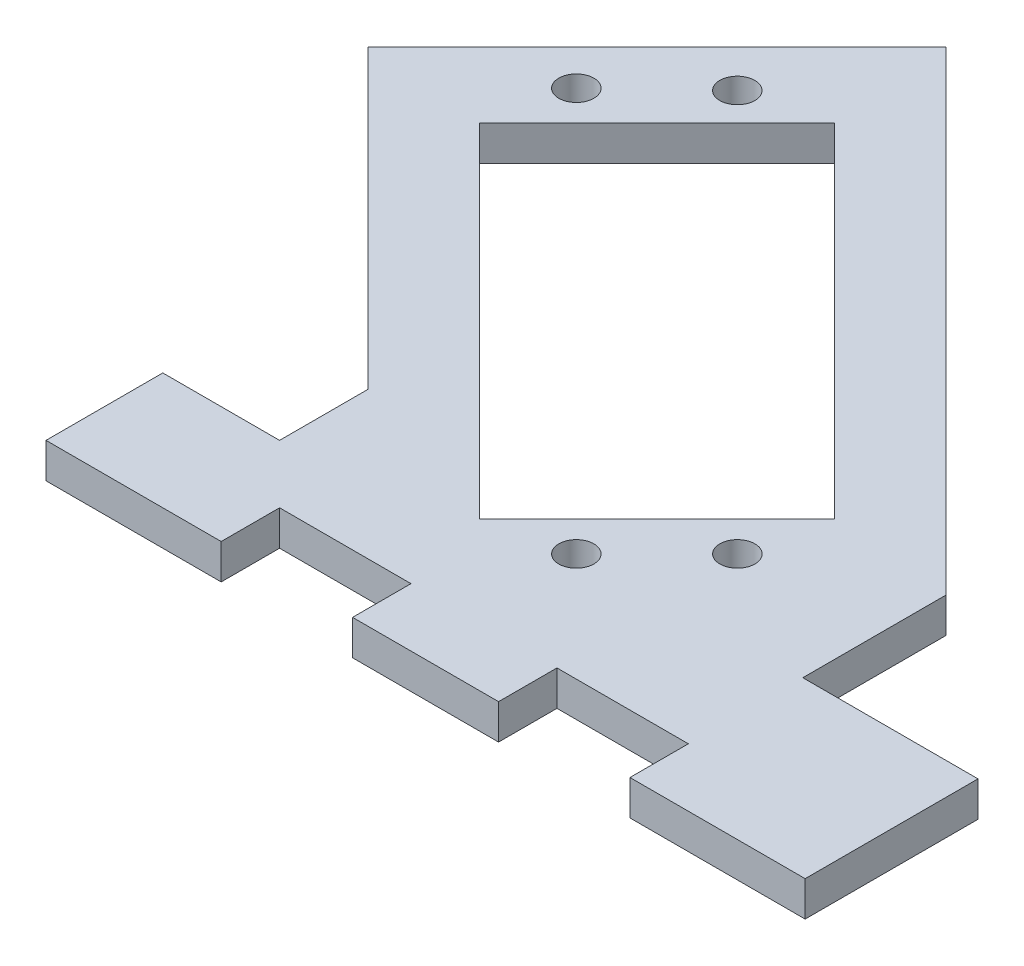
ISO-10303-21;
HEADER;
FILE_DESCRIPTION(('STEP AP214'),'2;1');
FILE_NAME('part.step','',(''),(''),'','','');
FILE_SCHEMA(('AUTOMOTIVE_DESIGN { 1 0 10303 214 1 1 1 1 }'));
ENDSEC;
DATA;
#1=APPLICATION_CONTEXT('core data for automotive mechanical design processes');
#2=APPLICATION_PROTOCOL_DEFINITION('international standard','automotive_design',2000,#1);
#3=PRODUCT_CONTEXT('',#1,'mechanical');
#4=PRODUCT('Part','Part','',(#3));
#5=PRODUCT_RELATED_PRODUCT_CATEGORY('part','',(#4));
#6=PRODUCT_DEFINITION_FORMATION('','',#4);
#7=PRODUCT_DEFINITION_CONTEXT('part definition',#1,'design');
#8=PRODUCT_DEFINITION('design','',#6,#7);
#9=PRODUCT_DEFINITION_SHAPE('','',#8);
#10=(LENGTH_UNIT() NAMED_UNIT(*) SI_UNIT(.MILLI.,.METRE.));
#11=(NAMED_UNIT(*) PLANE_ANGLE_UNIT() SI_UNIT($,.RADIAN.));
#12=(NAMED_UNIT(*) SI_UNIT($,.STERADIAN.) SOLID_ANGLE_UNIT());
#13=UNCERTAINTY_MEASURE_WITH_UNIT(LENGTH_MEASURE(1.E-05),#10,'distance_accuracy_value','');
#14=(GEOMETRIC_REPRESENTATION_CONTEXT(3) GLOBAL_UNCERTAINTY_ASSIGNED_CONTEXT((#13)) GLOBAL_UNIT_ASSIGNED_CONTEXT((#10,
#11,#12)) REPRESENTATION_CONTEXT('',''));
#15=CARTESIAN_POINT('',(0.,0.,0.));
#16=DIRECTION('',(0.,0.,1.));
#17=DIRECTION('',(1.,0.,0.));
#18=AXIS2_PLACEMENT_3D('',#15,#16,#17);
#19=CARTESIAN_POINT('',(0.,3.,0.));
#20=DIRECTION('',(0.,1.,0.));
#21=DIRECTION('',(0.,0.,1.));
#22=AXIS2_PLACEMENT_3D('',#19,#20,#21);
#23=PLANE('',#22);
#24=CARTESIAN_POINT('',(6.74820082835906,3.,-1.56030385058287));
#25=DIRECTION('',(0.,1.,0.));
#26=DIRECTION('',(0.,0.,1.));
#27=AXIS2_PLACEMENT_3D('',#24,#25,#26);
#28=CIRCLE('',#27,1.5);
#29=CARTESIAN_POINT('',(6.74820082835906,3.,-0.0603038505828715));
#30=VERTEX_POINT('',#29);
#31=EDGE_CURVE('E683',#30,#30,#28,.T.);
#32=ORIENTED_EDGE('',*,*,#31,.F.);
#33=EDGE_LOOP('',(#32));
#34=FACE_BOUND('',#33,.T.);
#35=CARTESIAN_POINT('',(-27.7846275686589,3.,-36.0931322476009));
#36=DIRECTION('',(0.,1.,0.));
#37=DIRECTION('',(0.,0.,1.));
#38=AXIS2_PLACEMENT_3D('',#35,#36,#37);
#39=CIRCLE('',#38,1.5);
#40=CARTESIAN_POINT('',(-27.7846275686589,3.,-34.5931322476009));
#41=VERTEX_POINT('',#40);
#42=EDGE_CURVE('E213',#41,#41,#39,.T.);
#43=ORIENTED_EDGE('',*,*,#42,.F.);
#44=EDGE_LOOP('',(#43));
#45=FACE_BOUND('',#44,.T.);
#46=DIRECTION('',(-0.707106781186546,0.,-0.707106781186549));
#47=VECTOR('',#46,1.);
#48=CARTESIAN_POINT('',(-15.0260191002141,3.,-54.9775522372541));
#49=LINE('',#48,#47);
#50=CARTESIAN_POINT('',(25.6239808997858,3.,-14.3275522372541));
#51=VERTEX_POINT('',#50);
#52=CARTESIAN_POINT('',(-15.0260191002141,3.,-54.9775522372541));
#53=VERTEX_POINT('',#52);
#54=EDGE_CURVE('E223',#51,#53,#49,.T.);
#55=ORIENTED_EDGE('',*,*,#54,.T.);
#56=DIRECTION('',(-0.707106781186551,0.,0.707106781186544));
#57=VECTOR('',#56,1.);
#58=CARTESIAN_POINT('',(-39.7747564417433,3.,-30.2288148957251));
#59=LINE('',#58,#57);
#60=CARTESIAN_POINT('',(-39.7747564417433,3.,-30.2288148957251));
#61=VERTEX_POINT('',#60);
#62=EDGE_CURVE('E226',#53,#61,#59,.T.);
#63=ORIENTED_EDGE('',*,*,#62,.T.);
#64=DIRECTION('',(0.707106781186546,0.,0.707106781186548));
#65=VECTOR('',#64,1.);
#66=CARTESIAN_POINT('',(-14.3760191002142,3.,-4.83007755419585));
#67=LINE('',#66,#65);
#68=CARTESIAN_POINT('',(-14.3760191002142,3.,-4.83007755419585));
#69=VERTEX_POINT('',#68);
#70=EDGE_CURVE('E229',#61,#69,#67,.T.);
#71=ORIENTED_EDGE('',*,*,#70,.T.);
#72=DIRECTION('',(0.,0.,1.));
#73=VECTOR('',#72,1.);
#74=CARTESIAN_POINT('',(-14.3760191002142,3.,-4.83007755419585));
#75=LINE('',#74,#73);
#76=CARTESIAN_POINT('',(-14.3760191002142,3.,2.7224477627459));
#77=VERTEX_POINT('',#76);
#78=EDGE_CURVE('E231',#69,#77,#75,.T.);
#79=ORIENTED_EDGE('',*,*,#78,.T.);
#80=DIRECTION('',(-1.,0.,0.));
#81=VECTOR('',#80,1.);
#82=CARTESIAN_POINT('',(-14.3760191002142,3.,2.7224477627459));
#83=LINE('',#82,#81);
#84=CARTESIAN_POINT('',(-24.3760191002142,3.,2.7224477627459));
#85=VERTEX_POINT('',#84);
#86=EDGE_CURVE('E233',#77,#85,#83,.T.);
#87=ORIENTED_EDGE('',*,*,#86,.T.);
#88=DIRECTION('',(0.,0.,1.));
#89=VECTOR('',#88,1.);
#90=CARTESIAN_POINT('',(-24.3760191002142,3.,2.7224477627459));
#91=LINE('',#90,#89);
#92=CARTESIAN_POINT('',(-24.3760191002142,3.,12.7224477627459));
#93=VERTEX_POINT('',#92);
#94=EDGE_CURVE('E235',#85,#93,#91,.T.);
#95=ORIENTED_EDGE('',*,*,#94,.T.);
#96=DIRECTION('',(1.,0.,0.));
#97=VECTOR('',#96,1.);
#98=CARTESIAN_POINT('',(-24.3760191002142,3.,12.7224477627459));
#99=LINE('',#98,#97);
#100=CARTESIAN_POINT('',(-9.3760191002142,3.,12.7224477627459));
#101=VERTEX_POINT('',#100);
#102=EDGE_CURVE('E237',#93,#101,#99,.T.);
#103=ORIENTED_EDGE('',*,*,#102,.T.);
#104=DIRECTION('',(0.,0.,-1.));
#105=VECTOR('',#104,1.);
#106=CARTESIAN_POINT('',(-9.3760191002142,3.,12.7224477627459));
#107=LINE('',#106,#105);
#108=CARTESIAN_POINT('',(-9.3760191002142,3.,7.7224477627459));
#109=VERTEX_POINT('',#108);
#110=EDGE_CURVE('E239',#101,#109,#107,.T.);
#111=ORIENTED_EDGE('',*,*,#110,.T.);
#112=DIRECTION('',(1.,0.,0.));
#113=VECTOR('',#112,1.);
#114=CARTESIAN_POINT('',(-9.3760191002142,3.,7.7224477627459));
#115=LINE('',#114,#113);
#116=CARTESIAN_POINT('',(1.87398089978579,3.,7.7224477627459));
#117=VERTEX_POINT('',#116);
#118=EDGE_CURVE('E241',#109,#117,#115,.T.);
#119=ORIENTED_EDGE('',*,*,#118,.T.);
#120=DIRECTION('',(0.,0.,1.));
#121=VECTOR('',#120,1.);
#122=CARTESIAN_POINT('',(1.87398089978579,3.,7.7224477627459));
#123=LINE('',#122,#121);
#124=CARTESIAN_POINT('',(1.87398089978579,3.,12.7224477627459));
#125=VERTEX_POINT('',#124);
#126=EDGE_CURVE('E243',#117,#125,#123,.T.);
#127=ORIENTED_EDGE('',*,*,#126,.T.);
#128=DIRECTION('',(1.,0.,0.));
#129=VECTOR('',#128,1.);
#130=CARTESIAN_POINT('',(1.87398089978579,3.,12.7224477627459));
#131=LINE('',#130,#129);
#132=CARTESIAN_POINT('',(14.3739808997858,3.,12.7224477627459));
#133=VERTEX_POINT('',#132);
#134=EDGE_CURVE('E245',#125,#133,#131,.T.);
#135=ORIENTED_EDGE('',*,*,#134,.T.);
#136=DIRECTION('',(0.,0.,-1.));
#137=VECTOR('',#136,1.);
#138=CARTESIAN_POINT('',(14.3739808997858,3.,12.7224477627459));
#139=LINE('',#138,#137);
#140=CARTESIAN_POINT('',(14.3739808997858,3.,7.7224477627459));
#141=VERTEX_POINT('',#140);
#142=EDGE_CURVE('E247',#133,#141,#139,.T.);
#143=ORIENTED_EDGE('',*,*,#142,.T.);
#144=DIRECTION('',(1.,0.,0.));
#145=VECTOR('',#144,1.);
#146=CARTESIAN_POINT('',(14.3739808997858,3.,7.7224477627459));
#147=LINE('',#146,#145);
#148=CARTESIAN_POINT('',(25.6239808997858,3.,7.7224477627459));
#149=VERTEX_POINT('',#148);
#150=EDGE_CURVE('E249',#141,#149,#147,.T.);
#151=ORIENTED_EDGE('',*,*,#150,.T.);
#152=DIRECTION('',(0.,0.,1.));
#153=VECTOR('',#152,1.);
#154=CARTESIAN_POINT('',(25.6239808997858,3.,7.7224477627459));
#155=LINE('',#154,#153);
#156=CARTESIAN_POINT('',(25.6239808997858,3.,12.7224477627459));
#157=VERTEX_POINT('',#156);
#158=EDGE_CURVE('E251',#149,#157,#155,.T.);
#159=ORIENTED_EDGE('',*,*,#158,.T.);
#160=DIRECTION('',(1.,0.,0.));
#161=VECTOR('',#160,1.);
#162=CARTESIAN_POINT('',(25.6239808997858,3.,12.7224477627459));
#163=LINE('',#162,#161);
#164=CARTESIAN_POINT('',(40.6239808997858,3.,12.7224477627459));
#165=VERTEX_POINT('',#164);
#166=EDGE_CURVE('E253',#157,#165,#163,.T.);
#167=ORIENTED_EDGE('',*,*,#166,.T.);
#168=DIRECTION('',(0.,0.,-1.));
#169=VECTOR('',#168,1.);
#170=CARTESIAN_POINT('',(40.6239808997858,3.,12.7224477627459));
#171=LINE('',#170,#169);
#172=CARTESIAN_POINT('',(40.6239808997858,3.,-2.07755223725412));
#173=VERTEX_POINT('',#172);
#174=EDGE_CURVE('E255',#165,#173,#171,.T.);
#175=ORIENTED_EDGE('',*,*,#174,.T.);
#176=DIRECTION('',(-1.,0.,0.));
#177=VECTOR('',#176,1.);
#178=CARTESIAN_POINT('',(25.6239808997858,3.,-2.07755223725411));
#179=LINE('',#178,#177);
#180=CARTESIAN_POINT('',(25.6239808997858,3.,-2.07755223725411));
#181=VERTEX_POINT('',#180);
#182=EDGE_CURVE('E257',#173,#181,#179,.T.);
#183=ORIENTED_EDGE('',*,*,#182,.T.);
#184=DIRECTION('',(0.,0.,-1.));
#185=VECTOR('',#184,1.);
#186=CARTESIAN_POINT('',(25.6239808997858,3.,-14.3275522372541));
#187=LINE('',#186,#185);
#188=EDGE_CURVE('E259',#181,#51,#187,.T.);
#189=ORIENTED_EDGE('',*,*,#188,.T.);
#190=EDGE_LOOP('',(#55,#63,#71,#79,#87,#95,#103,#111,#119,#127,#135,#143,#151,#159,#167,#175,
#183,#189));
#191=FACE_BOUND('',#190,.T.);
#192=DIRECTION('',(0.707106781186549,0.,-0.707106781186546));
#193=VECTOR('',#192,1.);
#194=CARTESIAN_POINT('',(0.,3.,0.));
#195=LINE('',#194,#193);
#196=CARTESIAN_POINT('',(0.,3.,0.));
#197=VERTEX_POINT('',#196);
#198=CARTESIAN_POINT('',(15.2027957955108,3.,-15.2027957955108));
#199=VERTEX_POINT('',#198);
#200=EDGE_CURVE('E192',#197,#199,#195,.T.);
#201=ORIENTED_EDGE('',*,*,#200,.F.);
#202=DIRECTION('',(0.707106781186546,0.,0.707106781186549));
#203=VECTOR('',#202,1.);
#204=CARTESIAN_POINT('',(-29.3449314192418,3.,-29.3449314192419));
#205=LINE('',#204,#203);
#206=CARTESIAN_POINT('',(-29.3449314192418,3.,-29.3449314192419));
#207=VERTEX_POINT('',#206);
#208=EDGE_CURVE('E184',#207,#197,#205,.T.);
#209=ORIENTED_EDGE('',*,*,#208,.F.);
#210=DIRECTION('',(-0.707106781186554,0.,0.707106781186541));
#211=VECTOR('',#210,1.);
#212=CARTESIAN_POINT('',(-14.1421356237309,3.,-44.5477272147525));
#213=LINE('',#212,#211);
#214=CARTESIAN_POINT('',(-14.1421356237309,3.,-44.5477272147525));
#215=VERTEX_POINT('',#214);
#216=EDGE_CURVE('E207',#215,#207,#213,.T.);
#217=ORIENTED_EDGE('',*,*,#216,.F.);
#218=DIRECTION('',(-0.707106781186547,0.,-0.707106781186549));
#219=VECTOR('',#218,1.);
#220=CARTESIAN_POINT('',(15.2027957955108,3.,-15.2027957955108));
#221=LINE('',#220,#219);
#222=EDGE_CURVE('E205',#199,#215,#221,.T.);
#223=ORIENTED_EDGE('',*,*,#222,.F.);
#224=EDGE_LOOP('',(#201,#209,#217,#223));
#225=FACE_BOUND('',#224,.T.);
#226=CARTESIAN_POINT('',(-20.7249311211853,3.,-42.8179509120356));
#227=DIRECTION('',(0.,1.,0.));
#228=DIRECTION('',(0.,0.,1.));
#229=AXIS2_PLACEMENT_3D('',#226,#227,#228);
#230=CIRCLE('',#229,1.5);
#231=CARTESIAN_POINT('',(-20.7249311211853,3.,-41.3179509120356));
#232=VERTEX_POINT('',#231);
#233=EDGE_CURVE('E689',#232,#232,#230,.T.);
#234=ORIENTED_EDGE('',*,*,#233,.F.);
#235=EDGE_LOOP('',(#234));
#236=FACE_BOUND('',#235,.T.);
#237=CARTESIAN_POINT('',(13.6424919449279,3.,-8.45459496715171));
#238=DIRECTION('',(0.,1.,0.));
#239=DIRECTION('',(0.,0.,1.));
#240=AXIS2_PLACEMENT_3D('',#237,#238,#239);
#241=CIRCLE('',#240,1.5);
#242=CARTESIAN_POINT('',(13.6424919449279,3.,-6.95459496715171));
#243=VERTEX_POINT('',#242);
#244=EDGE_CURVE('E674',#243,#243,#241,.T.);
#245=ORIENTED_EDGE('',*,*,#244,.F.);
#246=EDGE_LOOP('',(#245));
#247=FACE_BOUND('',#246,.T.);
#248=ADVANCED_FACE('F35',(#34,#45,#191,#225,#236,#247),#23,.T.);
#249=CARTESIAN_POINT('',(0.,0.,0.));
#250=DIRECTION('',(0.,1.,0.));
#251=DIRECTION('',(0.,0.,1.));
#252=AXIS2_PLACEMENT_3D('',#249,#250,#251);
#253=PLANE('',#252);
#254=DIRECTION('',(-0.707106781186546,0.,-0.707106781186549));
#255=VECTOR('',#254,1.);
#256=CARTESIAN_POINT('',(-15.0260191002141,0.,-54.9775522372541));
#257=LINE('',#256,#255);
#258=CARTESIAN_POINT('',(25.6239808997858,0.,-14.3275522372541));
#259=VERTEX_POINT('',#258);
#260=CARTESIAN_POINT('',(-15.0260191002141,0.,-54.9775522372541));
#261=VERTEX_POINT('',#260);
#262=EDGE_CURVE('E200',#259,#261,#257,.T.);
#263=ORIENTED_EDGE('',*,*,#262,.F.);
#264=DIRECTION('',(0.,0.,-1.));
#265=VECTOR('',#264,1.);
#266=CARTESIAN_POINT('',(25.6239808997858,0.,-14.3275522372541));
#267=LINE('',#266,#265);
#268=CARTESIAN_POINT('',(25.6239808997858,0.,-2.07755223725411));
#269=VERTEX_POINT('',#268);
#270=EDGE_CURVE('E227',#269,#259,#267,.T.);
#271=ORIENTED_EDGE('',*,*,#270,.F.);
#272=DIRECTION('',(-1.,0.,0.));
#273=VECTOR('',#272,1.);
#274=CARTESIAN_POINT('',(25.6239808997858,0.,-2.07755223725411));
#275=LINE('',#274,#273);
#276=CARTESIAN_POINT('',(40.6239808997858,0.,-2.07755223725412));
#277=VERTEX_POINT('',#276);
#278=EDGE_CURVE('E294',#277,#269,#275,.T.);
#279=ORIENTED_EDGE('',*,*,#278,.F.);
#280=DIRECTION('',(0.,0.,-1.));
#281=VECTOR('',#280,1.);
#282=CARTESIAN_POINT('',(40.6239808997858,0.,12.7224477627459));
#283=LINE('',#282,#281);
#284=CARTESIAN_POINT('',(40.6239808997858,0.,12.7224477627459));
#285=VERTEX_POINT('',#284);
#286=EDGE_CURVE('E292',#285,#277,#283,.T.);
#287=ORIENTED_EDGE('',*,*,#286,.F.);
#288=DIRECTION('',(1.,0.,0.));
#289=VECTOR('',#288,1.);
#290=CARTESIAN_POINT('',(25.6239808997858,0.,12.7224477627459));
#291=LINE('',#290,#289);
#292=CARTESIAN_POINT('',(25.6239808997858,0.,12.7224477627459));
#293=VERTEX_POINT('',#292);
#294=EDGE_CURVE('E290',#293,#285,#291,.T.);
#295=ORIENTED_EDGE('',*,*,#294,.F.);
#296=DIRECTION('',(0.,0.,1.));
#297=VECTOR('',#296,1.);
#298=CARTESIAN_POINT('',(25.6239808997858,0.,7.7224477627459));
#299=LINE('',#298,#297);
#300=CARTESIAN_POINT('',(25.6239808997858,0.,7.7224477627459));
#301=VERTEX_POINT('',#300);
#302=EDGE_CURVE('E288',#301,#293,#299,.T.);
#303=ORIENTED_EDGE('',*,*,#302,.F.);
#304=DIRECTION('',(1.,0.,0.));
#305=VECTOR('',#304,1.);
#306=CARTESIAN_POINT('',(14.3739808997858,0.,7.7224477627459));
#307=LINE('',#306,#305);
#308=CARTESIAN_POINT('',(14.3739808997858,0.,7.7224477627459));
#309=VERTEX_POINT('',#308);
#310=EDGE_CURVE('E286',#309,#301,#307,.T.);
#311=ORIENTED_EDGE('',*,*,#310,.F.);
#312=DIRECTION('',(0.,0.,-1.));
#313=VECTOR('',#312,1.);
#314=CARTESIAN_POINT('',(14.3739808997858,0.,12.7224477627459));
#315=LINE('',#314,#313);
#316=CARTESIAN_POINT('',(14.3739808997858,0.,12.7224477627459));
#317=VERTEX_POINT('',#316);
#318=EDGE_CURVE('E284',#317,#309,#315,.T.);
#319=ORIENTED_EDGE('',*,*,#318,.F.);
#320=DIRECTION('',(1.,0.,0.));
#321=VECTOR('',#320,1.);
#322=CARTESIAN_POINT('',(1.87398089978579,0.,12.7224477627459));
#323=LINE('',#322,#321);
#324=CARTESIAN_POINT('',(1.87398089978579,0.,12.7224477627459));
#325=VERTEX_POINT('',#324);
#326=EDGE_CURVE('E282',#325,#317,#323,.T.);
#327=ORIENTED_EDGE('',*,*,#326,.F.);
#328=DIRECTION('',(0.,0.,1.));
#329=VECTOR('',#328,1.);
#330=CARTESIAN_POINT('',(1.87398089978579,0.,7.7224477627459));
#331=LINE('',#330,#329);
#332=CARTESIAN_POINT('',(1.87398089978579,0.,7.7224477627459));
#333=VERTEX_POINT('',#332);
#334=EDGE_CURVE('E280',#333,#325,#331,.T.);
#335=ORIENTED_EDGE('',*,*,#334,.F.);
#336=DIRECTION('',(1.,0.,0.));
#337=VECTOR('',#336,1.);
#338=CARTESIAN_POINT('',(-9.3760191002142,0.,7.7224477627459));
#339=LINE('',#338,#337);
#340=CARTESIAN_POINT('',(-9.3760191002142,0.,7.7224477627459));
#341=VERTEX_POINT('',#340);
#342=EDGE_CURVE('E278',#341,#333,#339,.T.);
#343=ORIENTED_EDGE('',*,*,#342,.F.);
#344=DIRECTION('',(0.,0.,-1.));
#345=VECTOR('',#344,1.);
#346=CARTESIAN_POINT('',(-9.3760191002142,0.,12.7224477627459));
#347=LINE('',#346,#345);
#348=CARTESIAN_POINT('',(-9.3760191002142,0.,12.7224477627459));
#349=VERTEX_POINT('',#348);
#350=EDGE_CURVE('E276',#349,#341,#347,.T.);
#351=ORIENTED_EDGE('',*,*,#350,.F.);
#352=DIRECTION('',(1.,0.,0.));
#353=VECTOR('',#352,1.);
#354=CARTESIAN_POINT('',(-24.3760191002142,0.,12.7224477627459));
#355=LINE('',#354,#353);
#356=CARTESIAN_POINT('',(-24.3760191002142,0.,12.7224477627459));
#357=VERTEX_POINT('',#356);
#358=EDGE_CURVE('E274',#357,#349,#355,.T.);
#359=ORIENTED_EDGE('',*,*,#358,.F.);
#360=DIRECTION('',(0.,0.,1.));
#361=VECTOR('',#360,1.);
#362=CARTESIAN_POINT('',(-24.3760191002142,0.,2.7224477627459));
#363=LINE('',#362,#361);
#364=CARTESIAN_POINT('',(-24.3760191002142,0.,2.7224477627459));
#365=VERTEX_POINT('',#364);
#366=EDGE_CURVE('E272',#365,#357,#363,.T.);
#367=ORIENTED_EDGE('',*,*,#366,.F.);
#368=DIRECTION('',(-1.,0.,0.));
#369=VECTOR('',#368,1.);
#370=CARTESIAN_POINT('',(-14.3760191002142,0.,2.7224477627459));
#371=LINE('',#370,#369);
#372=CARTESIAN_POINT('',(-14.3760191002142,0.,2.7224477627459));
#373=VERTEX_POINT('',#372);
#374=EDGE_CURVE('E270',#373,#365,#371,.T.);
#375=ORIENTED_EDGE('',*,*,#374,.F.);
#376=DIRECTION('',(0.,0.,1.));
#377=VECTOR('',#376,1.);
#378=CARTESIAN_POINT('',(-14.3760191002142,0.,-4.83007755419585));
#379=LINE('',#378,#377);
#380=CARTESIAN_POINT('',(-14.3760191002142,0.,-4.83007755419585));
#381=VERTEX_POINT('',#380);
#382=EDGE_CURVE('E268',#381,#373,#379,.T.);
#383=ORIENTED_EDGE('',*,*,#382,.F.);
#384=DIRECTION('',(0.707106781186546,0.,0.707106781186548));
#385=VECTOR('',#384,1.);
#386=CARTESIAN_POINT('',(-14.3760191002142,0.,-4.83007755419585));
#387=LINE('',#386,#385);
#388=CARTESIAN_POINT('',(-39.7747564417433,0.,-30.2288148957251));
#389=VERTEX_POINT('',#388);
#390=EDGE_CURVE('E266',#389,#381,#387,.T.);
#391=ORIENTED_EDGE('',*,*,#390,.F.);
#392=DIRECTION('',(-0.707106781186551,0.,0.707106781186544));
#393=VECTOR('',#392,1.);
#394=CARTESIAN_POINT('',(-39.7747564417433,0.,-30.2288148957251));
#395=LINE('',#394,#393);
#396=EDGE_CURVE('E264',#261,#389,#395,.T.);
#397=ORIENTED_EDGE('',*,*,#396,.F.);
#398=EDGE_LOOP('',(#263,#271,#279,#287,#295,#303,#311,#319,#327,#335,#343,#351,#359,#367,#375,
#383,#391,#397));
#399=FACE_BOUND('',#398,.T.);
#400=DIRECTION('',(0.707106781186546,0.,0.707106781186549));
#401=VECTOR('',#400,1.);
#402=CARTESIAN_POINT('',(-29.3449314192418,0.,-29.3449314192419));
#403=LINE('',#402,#401);
#404=CARTESIAN_POINT('',(-29.3449314192418,0.,-29.3449314192419));
#405=VERTEX_POINT('',#404);
#406=CARTESIAN_POINT('',(0.,0.,0.));
#407=VERTEX_POINT('',#406);
#408=EDGE_CURVE('E58',#405,#407,#403,.T.);
#409=ORIENTED_EDGE('',*,*,#408,.T.);
#410=DIRECTION('',(0.707106781186549,0.,-0.707106781186546));
#411=VECTOR('',#410,1.);
#412=CARTESIAN_POINT('',(0.,0.,0.));
#413=LINE('',#412,#411);
#414=CARTESIAN_POINT('',(15.2027957955108,0.,-15.2027957955108));
#415=VERTEX_POINT('',#414);
#416=EDGE_CURVE('E199',#407,#415,#413,.T.);
#417=ORIENTED_EDGE('',*,*,#416,.T.);
#418=DIRECTION('',(-0.707106781186547,0.,-0.707106781186549));
#419=VECTOR('',#418,1.);
#420=CARTESIAN_POINT('',(15.2027957955108,0.,-15.2027957955108));
#421=LINE('',#420,#419);
#422=CARTESIAN_POINT('',(-14.1421356237309,0.,-44.5477272147525));
#423=VERTEX_POINT('',#422);
#424=EDGE_CURVE('E215',#415,#423,#421,.T.);
#425=ORIENTED_EDGE('',*,*,#424,.T.);
#426=DIRECTION('',(-0.707106781186554,0.,0.707106781186541));
#427=VECTOR('',#426,1.);
#428=CARTESIAN_POINT('',(-14.1421356237309,0.,-44.5477272147525));
#429=LINE('',#428,#427);
#430=EDGE_CURVE('E193',#423,#405,#429,.T.);
#431=ORIENTED_EDGE('',*,*,#430,.T.);
#432=EDGE_LOOP('',(#409,#417,#425,#431));
#433=FACE_BOUND('',#432,.T.);
#434=CARTESIAN_POINT('',(-27.7846275686589,0.,-36.0931322476009));
#435=DIRECTION('',(0.,1.,0.));
#436=DIRECTION('',(0.,0.,1.));
#437=AXIS2_PLACEMENT_3D('',#434,#435,#436);
#438=CIRCLE('',#437,1.5);
#439=CARTESIAN_POINT('',(-27.7846275686589,0.,-34.5931322476009));
#440=VERTEX_POINT('',#439);
#441=EDGE_CURVE('E692',#440,#440,#438,.T.);
#442=ORIENTED_EDGE('',*,*,#441,.T.);
#443=EDGE_LOOP('',(#442));
#444=FACE_BOUND('',#443,.T.);
#445=CARTESIAN_POINT('',(-20.7249311211853,0.,-42.8179509120356));
#446=DIRECTION('',(0.,1.,0.));
#447=DIRECTION('',(0.,0.,1.));
#448=AXIS2_PLACEMENT_3D('',#445,#446,#447);
#449=CIRCLE('',#448,1.5);
#450=CARTESIAN_POINT('',(-20.7249311211853,0.,-41.3179509120356));
#451=VERTEX_POINT('',#450);
#452=EDGE_CURVE('E686',#451,#451,#449,.T.);
#453=ORIENTED_EDGE('',*,*,#452,.T.);
#454=EDGE_LOOP('',(#453));
#455=FACE_BOUND('',#454,.T.);
#456=CARTESIAN_POINT('',(6.74820082835906,0.,-1.56030385058287));
#457=DIRECTION('',(0.,1.,0.));
#458=DIRECTION('',(0.,0.,1.));
#459=AXIS2_PLACEMENT_3D('',#456,#457,#458);
#460=CIRCLE('',#459,1.5);
#461=CARTESIAN_POINT('',(6.74820082835906,0.,-0.0603038505828715));
#462=VERTEX_POINT('',#461);
#463=EDGE_CURVE('E680',#462,#462,#460,.T.);
#464=ORIENTED_EDGE('',*,*,#463,.T.);
#465=EDGE_LOOP('',(#464));
#466=FACE_BOUND('',#465,.T.);
#467=CARTESIAN_POINT('',(13.6424919449279,0.,-8.45459496715171));
#468=DIRECTION('',(0.,1.,0.));
#469=DIRECTION('',(0.,0.,1.));
#470=AXIS2_PLACEMENT_3D('',#467,#468,#469);
#471=CIRCLE('',#470,1.5);
#472=CARTESIAN_POINT('',(13.6424919449279,0.,-6.95459496715171));
#473=VERTEX_POINT('',#472);
#474=EDGE_CURVE('E677',#473,#473,#471,.T.);
#475=ORIENTED_EDGE('',*,*,#474,.T.);
#476=EDGE_LOOP('',(#475));
#477=FACE_BOUND('',#476,.T.);
#478=ADVANCED_FACE('F354',(#399,#433,#444,#455,#466,#477),#253,.F.);
#479=CARTESIAN_POINT('',(-15.0260191002141,3.,-54.9775522372541));
#480=DIRECTION('',(-0.707106781186548,0.,0.707106781186546));
#481=DIRECTION('',(0.707106781186546,0.,0.707106781186549));
#482=AXIS2_PLACEMENT_3D('',#479,#480,#481);
#483=PLANE('',#482);
#484=ORIENTED_EDGE('',*,*,#262,.T.);
#485=DIRECTION('',(0.,-1.,0.));
#486=VECTOR('',#485,1.);
#487=CARTESIAN_POINT('',(-15.0260191002141,3.,-54.9775522372541));
#488=LINE('',#487,#486);
#489=EDGE_CURVE('E11',#53,#261,#488,.T.);
#490=ORIENTED_EDGE('',*,*,#489,.F.);
#491=ORIENTED_EDGE('',*,*,#54,.F.);
#492=DIRECTION('',(0.,-1.,0.));
#493=VECTOR('',#492,1.);
#494=CARTESIAN_POINT('',(25.6239808997858,3.,-14.3275522372541));
#495=LINE('',#494,#493);
#496=EDGE_CURVE('E261',#51,#259,#495,.T.);
#497=ORIENTED_EDGE('',*,*,#496,.T.);
#498=EDGE_LOOP('',(#484,#490,#491,#497));
#499=FACE_BOUND('',#498,.T.);
#500=ADVANCED_FACE('F37',(#499),#483,.F.);
#501=CARTESIAN_POINT('',(-39.7747564417433,3.,-30.2288148957251));
#502=DIRECTION('',(0.707106781186544,0.,0.707106781186551));
#503=DIRECTION('',(0.707106781186551,0.,-0.707106781186544));
#504=AXIS2_PLACEMENT_3D('',#501,#502,#503);
#505=PLANE('',#504);
#506=ORIENTED_EDGE('',*,*,#396,.T.);
#507=DIRECTION('',(0.,-1.,0.));
#508=VECTOR('',#507,1.);
#509=CARTESIAN_POINT('',(-39.7747564417433,3.,-30.2288148957251));
#510=LINE('',#509,#508);
#511=EDGE_CURVE('E43',#61,#389,#510,.T.);
#512=ORIENTED_EDGE('',*,*,#511,.F.);
#513=ORIENTED_EDGE('',*,*,#62,.F.);
#514=ORIENTED_EDGE('',*,*,#489,.T.);
#515=EDGE_LOOP('',(#506,#512,#513,#514));
#516=FACE_BOUND('',#515,.T.);
#517=ADVANCED_FACE('F371',(#516),#505,.F.);
#518=CARTESIAN_POINT('',(-14.3760191002142,3.,-4.83007755419585));
#519=DIRECTION('',(0.707106781186548,0.,-0.707106781186547));
#520=DIRECTION('',(-0.707106781186547,0.,-0.707106781186548));
#521=AXIS2_PLACEMENT_3D('',#518,#519,#520);
#522=PLANE('',#521);
#523=ORIENTED_EDGE('',*,*,#390,.T.);
#524=DIRECTION('',(0.,-1.,0.));
#525=VECTOR('',#524,1.);
#526=CARTESIAN_POINT('',(-14.3760191002142,3.,-4.83007755419585));
#527=LINE('',#526,#525);
#528=EDGE_CURVE('E341',#69,#381,#527,.T.);
#529=ORIENTED_EDGE('',*,*,#528,.F.);
#530=ORIENTED_EDGE('',*,*,#70,.F.);
#531=ORIENTED_EDGE('',*,*,#511,.T.);
#532=EDGE_LOOP('',(#523,#529,#530,#531));
#533=FACE_BOUND('',#532,.T.);
#534=ADVANCED_FACE('F348',(#533),#522,.F.);
#535=CARTESIAN_POINT('',(-14.3760191002142,3.,-4.83007755419585));
#536=DIRECTION('',(1.,0.,0.));
#537=DIRECTION('',(0.,0.,-1.));
#538=AXIS2_PLACEMENT_3D('',#535,#536,#537);
#539=PLANE('',#538);
#540=ORIENTED_EDGE('',*,*,#382,.T.);
#541=DIRECTION('',(0.,-1.,0.));
#542=VECTOR('',#541,1.);
#543=CARTESIAN_POINT('',(-14.3760191002142,3.,2.7224477627459));
#544=LINE('',#543,#542);
#545=EDGE_CURVE('E338',#77,#373,#544,.T.);
#546=ORIENTED_EDGE('',*,*,#545,.F.);
#547=ORIENTED_EDGE('',*,*,#78,.F.);
#548=ORIENTED_EDGE('',*,*,#528,.T.);
#549=EDGE_LOOP('',(#540,#546,#547,#548));
#550=FACE_BOUND('',#549,.T.);
#551=ADVANCED_FACE('F360',(#550),#539,.F.);
#552=CARTESIAN_POINT('',(-14.3760191002142,3.,2.7224477627459));
#553=DIRECTION('',(0.,0.,1.));
#554=DIRECTION('',(1.,0.,0.));
#555=AXIS2_PLACEMENT_3D('',#552,#553,#554);
#556=PLANE('',#555);
#557=ORIENTED_EDGE('',*,*,#374,.T.);
#558=DIRECTION('',(0.,-1.,0.));
#559=VECTOR('',#558,1.);
#560=CARTESIAN_POINT('',(-24.3760191002142,3.,2.7224477627459));
#561=LINE('',#560,#559);
#562=EDGE_CURVE('E335',#85,#365,#561,.T.);
#563=ORIENTED_EDGE('',*,*,#562,.F.);
#564=ORIENTED_EDGE('',*,*,#86,.F.);
#565=ORIENTED_EDGE('',*,*,#545,.T.);
#566=EDGE_LOOP('',(#557,#563,#564,#565));
#567=FACE_BOUND('',#566,.T.);
#568=ADVANCED_FACE('F364',(#567),#556,.F.);
#569=CARTESIAN_POINT('',(-24.3760191002142,3.,2.7224477627459));
#570=DIRECTION('',(1.,0.,0.));
#571=DIRECTION('',(0.,0.,-1.));
#572=AXIS2_PLACEMENT_3D('',#569,#570,#571);
#573=PLANE('',#572);
#574=ORIENTED_EDGE('',*,*,#366,.T.);
#575=DIRECTION('',(0.,-1.,0.));
#576=VECTOR('',#575,1.);
#577=CARTESIAN_POINT('',(-24.3760191002142,3.,12.7224477627459));
#578=LINE('',#577,#576);
#579=EDGE_CURVE('E332',#93,#357,#578,.T.);
#580=ORIENTED_EDGE('',*,*,#579,.F.);
#581=ORIENTED_EDGE('',*,*,#94,.F.);
#582=ORIENTED_EDGE('',*,*,#562,.T.);
#583=EDGE_LOOP('',(#574,#580,#581,#582));
#584=FACE_BOUND('',#583,.T.);
#585=ADVANCED_FACE('F434',(#584),#573,.F.);
#586=CARTESIAN_POINT('',(-24.3760191002142,3.,12.7224477627459));
#587=DIRECTION('',(0.,0.,-1.));
#588=DIRECTION('',(-1.,0.,0.));
#589=AXIS2_PLACEMENT_3D('',#586,#587,#588);
#590=PLANE('',#589);
#591=ORIENTED_EDGE('',*,*,#358,.T.);
#592=DIRECTION('',(0.,-1.,0.));
#593=VECTOR('',#592,1.);
#594=CARTESIAN_POINT('',(-9.3760191002142,3.,12.7224477627459));
#595=LINE('',#594,#593);
#596=EDGE_CURVE('E329',#101,#349,#595,.T.);
#597=ORIENTED_EDGE('',*,*,#596,.F.);
#598=ORIENTED_EDGE('',*,*,#102,.F.);
#599=ORIENTED_EDGE('',*,*,#579,.T.);
#600=EDGE_LOOP('',(#591,#597,#598,#599));
#601=FACE_BOUND('',#600,.T.);
#602=ADVANCED_FACE('F432',(#601),#590,.F.);
#603=CARTESIAN_POINT('',(-9.3760191002142,3.,12.7224477627459));
#604=DIRECTION('',(-1.,0.,0.));
#605=DIRECTION('',(0.,0.,1.));
#606=AXIS2_PLACEMENT_3D('',#603,#604,#605);
#607=PLANE('',#606);
#608=ORIENTED_EDGE('',*,*,#350,.T.);
#609=DIRECTION('',(0.,-1.,0.));
#610=VECTOR('',#609,1.);
#611=CARTESIAN_POINT('',(-9.3760191002142,3.,7.7224477627459));
#612=LINE('',#611,#610);
#613=EDGE_CURVE('E326',#109,#341,#612,.T.);
#614=ORIENTED_EDGE('',*,*,#613,.F.);
#615=ORIENTED_EDGE('',*,*,#110,.F.);
#616=ORIENTED_EDGE('',*,*,#596,.T.);
#617=EDGE_LOOP('',(#608,#614,#615,#616));
#618=FACE_BOUND('',#617,.T.);
#619=ADVANCED_FACE('F428',(#618),#607,.F.);
#620=CARTESIAN_POINT('',(-9.3760191002142,3.,7.7224477627459));
#621=DIRECTION('',(0.,0.,-1.));
#622=DIRECTION('',(-1.,0.,0.));
#623=AXIS2_PLACEMENT_3D('',#620,#621,#622);
#624=PLANE('',#623);
#625=ORIENTED_EDGE('',*,*,#342,.T.);
#626=DIRECTION('',(0.,-1.,0.));
#627=VECTOR('',#626,1.);
#628=CARTESIAN_POINT('',(1.87398089978579,3.,7.7224477627459));
#629=LINE('',#628,#627);
#630=EDGE_CURVE('E323',#117,#333,#629,.T.);
#631=ORIENTED_EDGE('',*,*,#630,.F.);
#632=ORIENTED_EDGE('',*,*,#118,.F.);
#633=ORIENTED_EDGE('',*,*,#613,.T.);
#634=EDGE_LOOP('',(#625,#631,#632,#633));
#635=FACE_BOUND('',#634,.T.);
#636=ADVANCED_FACE('F423',(#635),#624,.F.);
#637=CARTESIAN_POINT('',(1.87398089978579,3.,7.7224477627459));
#638=DIRECTION('',(1.,0.,0.));
#639=DIRECTION('',(0.,0.,-1.));
#640=AXIS2_PLACEMENT_3D('',#637,#638,#639);
#641=PLANE('',#640);
#642=ORIENTED_EDGE('',*,*,#334,.T.);
#643=DIRECTION('',(0.,-1.,0.));
#644=VECTOR('',#643,1.);
#645=CARTESIAN_POINT('',(1.87398089978579,3.,12.7224477627459));
#646=LINE('',#645,#644);
#647=EDGE_CURVE('E320',#125,#325,#646,.T.);
#648=ORIENTED_EDGE('',*,*,#647,.F.);
#649=ORIENTED_EDGE('',*,*,#126,.F.);
#650=ORIENTED_EDGE('',*,*,#630,.T.);
#651=EDGE_LOOP('',(#642,#648,#649,#650));
#652=FACE_BOUND('',#651,.T.);
#653=ADVANCED_FACE('F417',(#652),#641,.F.);
#654=CARTESIAN_POINT('',(1.87398089978579,3.,12.7224477627459));
#655=DIRECTION('',(0.,0.,-1.));
#656=DIRECTION('',(-1.,0.,0.));
#657=AXIS2_PLACEMENT_3D('',#654,#655,#656);
#658=PLANE('',#657);
#659=ORIENTED_EDGE('',*,*,#326,.T.);
#660=DIRECTION('',(0.,-1.,0.));
#661=VECTOR('',#660,1.);
#662=CARTESIAN_POINT('',(14.3739808997858,3.,12.7224477627459));
#663=LINE('',#662,#661);
#664=EDGE_CURVE('E317',#133,#317,#663,.T.);
#665=ORIENTED_EDGE('',*,*,#664,.F.);
#666=ORIENTED_EDGE('',*,*,#134,.F.);
#667=ORIENTED_EDGE('',*,*,#647,.T.);
#668=EDGE_LOOP('',(#659,#665,#666,#667));
#669=FACE_BOUND('',#668,.T.);
#670=ADVANCED_FACE('F413',(#669),#658,.F.);
#671=CARTESIAN_POINT('',(14.3739808997858,3.,12.7224477627459));
#672=DIRECTION('',(-1.,0.,0.));
#673=DIRECTION('',(0.,0.,1.));
#674=AXIS2_PLACEMENT_3D('',#671,#672,#673);
#675=PLANE('',#674);
#676=ORIENTED_EDGE('',*,*,#318,.T.);
#677=DIRECTION('',(0.,-1.,0.));
#678=VECTOR('',#677,1.);
#679=CARTESIAN_POINT('',(14.3739808997858,3.,7.7224477627459));
#680=LINE('',#679,#678);
#681=EDGE_CURVE('E314',#141,#309,#680,.T.);
#682=ORIENTED_EDGE('',*,*,#681,.F.);
#683=ORIENTED_EDGE('',*,*,#142,.F.);
#684=ORIENTED_EDGE('',*,*,#664,.T.);
#685=EDGE_LOOP('',(#676,#682,#683,#684));
#686=FACE_BOUND('',#685,.T.);
#687=ADVANCED_FACE('F408',(#686),#675,.F.);
#688=CARTESIAN_POINT('',(14.3739808997858,3.,7.7224477627459));
#689=DIRECTION('',(0.,0.,-1.));
#690=DIRECTION('',(-1.,0.,0.));
#691=AXIS2_PLACEMENT_3D('',#688,#689,#690);
#692=PLANE('',#691);
#693=ORIENTED_EDGE('',*,*,#310,.T.);
#694=DIRECTION('',(0.,-1.,0.));
#695=VECTOR('',#694,1.);
#696=CARTESIAN_POINT('',(25.6239808997858,3.,7.7224477627459));
#697=LINE('',#696,#695);
#698=EDGE_CURVE('E311',#149,#301,#697,.T.);
#699=ORIENTED_EDGE('',*,*,#698,.F.);
#700=ORIENTED_EDGE('',*,*,#150,.F.);
#701=ORIENTED_EDGE('',*,*,#681,.T.);
#702=EDGE_LOOP('',(#693,#699,#700,#701));
#703=FACE_BOUND('',#702,.T.);
#704=ADVANCED_FACE('F402',(#703),#692,.F.);
#705=CARTESIAN_POINT('',(25.6239808997858,3.,7.7224477627459));
#706=DIRECTION('',(1.,0.,0.));
#707=DIRECTION('',(0.,0.,-1.));
#708=AXIS2_PLACEMENT_3D('',#705,#706,#707);
#709=PLANE('',#708);
#710=ORIENTED_EDGE('',*,*,#302,.T.);
#711=DIRECTION('',(0.,-1.,0.));
#712=VECTOR('',#711,1.);
#713=CARTESIAN_POINT('',(25.6239808997858,3.,12.7224477627459));
#714=LINE('',#713,#712);
#715=EDGE_CURVE('E308',#157,#293,#714,.T.);
#716=ORIENTED_EDGE('',*,*,#715,.F.);
#717=ORIENTED_EDGE('',*,*,#158,.F.);
#718=ORIENTED_EDGE('',*,*,#698,.T.);
#719=EDGE_LOOP('',(#710,#716,#717,#718));
#720=FACE_BOUND('',#719,.T.);
#721=ADVANCED_FACE('F398',(#720),#709,.F.);
#722=CARTESIAN_POINT('',(25.6239808997858,3.,12.7224477627459));
#723=DIRECTION('',(0.,0.,-1.));
#724=DIRECTION('',(-1.,0.,0.));
#725=AXIS2_PLACEMENT_3D('',#722,#723,#724);
#726=PLANE('',#725);
#727=ORIENTED_EDGE('',*,*,#294,.T.);
#728=DIRECTION('',(0.,-1.,0.));
#729=VECTOR('',#728,1.);
#730=CARTESIAN_POINT('',(40.6239808997858,3.,12.7224477627459));
#731=LINE('',#730,#729);
#732=EDGE_CURVE('E305',#165,#285,#731,.T.);
#733=ORIENTED_EDGE('',*,*,#732,.F.);
#734=ORIENTED_EDGE('',*,*,#166,.F.);
#735=ORIENTED_EDGE('',*,*,#715,.T.);
#736=EDGE_LOOP('',(#727,#733,#734,#735));
#737=FACE_BOUND('',#736,.T.);
#738=ADVANCED_FACE('F393',(#737),#726,.F.);
#739=CARTESIAN_POINT('',(40.6239808997858,3.,12.7224477627459));
#740=DIRECTION('',(-1.,0.,0.));
#741=DIRECTION('',(0.,0.,1.));
#742=AXIS2_PLACEMENT_3D('',#739,#740,#741);
#743=PLANE('',#742);
#744=ORIENTED_EDGE('',*,*,#286,.T.);
#745=DIRECTION('',(0.,-1.,0.));
#746=VECTOR('',#745,1.);
#747=CARTESIAN_POINT('',(40.6239808997858,3.,-2.07755223725412));
#748=LINE('',#747,#746);
#749=EDGE_CURVE('E302',#173,#277,#748,.T.);
#750=ORIENTED_EDGE('',*,*,#749,.F.);
#751=ORIENTED_EDGE('',*,*,#174,.F.);
#752=ORIENTED_EDGE('',*,*,#732,.T.);
#753=EDGE_LOOP('',(#744,#750,#751,#752));
#754=FACE_BOUND('',#753,.T.);
#755=ADVANCED_FACE('F387',(#754),#743,.F.);
#756=CARTESIAN_POINT('',(25.6239808997858,3.,-2.07755223725411));
#757=DIRECTION('',(0.,0.,1.));
#758=DIRECTION('',(1.,0.,0.));
#759=AXIS2_PLACEMENT_3D('',#756,#757,#758);
#760=PLANE('',#759);
#761=ORIENTED_EDGE('',*,*,#278,.T.);
#762=DIRECTION('',(0.,-1.,0.));
#763=VECTOR('',#762,1.);
#764=CARTESIAN_POINT('',(25.6239808997858,3.,-2.07755223725411));
#765=LINE('',#764,#763);
#766=EDGE_CURVE('E299',#181,#269,#765,.T.);
#767=ORIENTED_EDGE('',*,*,#766,.F.);
#768=ORIENTED_EDGE('',*,*,#182,.F.);
#769=ORIENTED_EDGE('',*,*,#749,.T.);
#770=EDGE_LOOP('',(#761,#767,#768,#769));
#771=FACE_BOUND('',#770,.T.);
#772=ADVANCED_FACE('F383',(#771),#760,.F.);
#773=CARTESIAN_POINT('',(25.6239808997858,3.,-14.3275522372541));
#774=DIRECTION('',(-1.,0.,0.));
#775=DIRECTION('',(0.,0.,1.));
#776=AXIS2_PLACEMENT_3D('',#773,#774,#775);
#777=PLANE('',#776);
#778=ORIENTED_EDGE('',*,*,#270,.T.);
#779=ORIENTED_EDGE('',*,*,#496,.F.);
#780=ORIENTED_EDGE('',*,*,#188,.F.);
#781=ORIENTED_EDGE('',*,*,#766,.T.);
#782=EDGE_LOOP('',(#778,#779,#780,#781));
#783=FACE_BOUND('',#782,.T.);
#784=ADVANCED_FACE('F378',(#783),#777,.F.);
#785=CARTESIAN_POINT('',(-29.3449314192418,3.,-29.3449314192419));
#786=DIRECTION('',(0.707106781186549,0.,-0.707106781186546));
#787=DIRECTION('',(-0.707106781186546,0.,-0.707106781186549));
#788=AXIS2_PLACEMENT_3D('',#785,#786,#787);
#789=PLANE('',#788);
#790=ORIENTED_EDGE('',*,*,#408,.F.);
#791=DIRECTION('',(0.,-1.,0.));
#792=VECTOR('',#791,1.);
#793=CARTESIAN_POINT('',(-29.3449314192418,3.,-29.3449314192419));
#794=LINE('',#793,#792);
#795=EDGE_CURVE('E188',#207,#405,#794,.T.);
#796=ORIENTED_EDGE('',*,*,#795,.F.);
#797=ORIENTED_EDGE('',*,*,#208,.T.);
#798=DIRECTION('',(0.,-1.,0.));
#799=VECTOR('',#798,1.);
#800=CARTESIAN_POINT('',(0.,3.,0.));
#801=LINE('',#800,#799);
#802=EDGE_CURVE('E187',#197,#407,#801,.T.);
#803=ORIENTED_EDGE('',*,*,#802,.T.);
#804=EDGE_LOOP('',(#790,#796,#797,#803));
#805=FACE_BOUND('',#804,.T.);
#806=ADVANCED_FACE('F186',(#805),#789,.T.);
#807=CARTESIAN_POINT('',(0.,3.,0.));
#808=DIRECTION('',(-0.707106781186546,0.,-0.707106781186548));
#809=DIRECTION('',(-0.707106781186549,0.,0.707106781186546));
#810=AXIS2_PLACEMENT_3D('',#807,#808,#809);
#811=PLANE('',#810);
#812=ORIENTED_EDGE('',*,*,#416,.F.);
#813=ORIENTED_EDGE('',*,*,#802,.F.);
#814=ORIENTED_EDGE('',*,*,#200,.T.);
#815=DIRECTION('',(0.,-1.,0.));
#816=VECTOR('',#815,1.);
#817=CARTESIAN_POINT('',(15.2027957955108,3.,-15.2027957955108));
#818=LINE('',#817,#816);
#819=EDGE_CURVE('E201',#199,#415,#818,.T.);
#820=ORIENTED_EDGE('',*,*,#819,.T.);
#821=EDGE_LOOP('',(#812,#813,#814,#820));
#822=FACE_BOUND('',#821,.T.);
#823=ADVANCED_FACE('F196',(#822),#811,.T.);
#824=CARTESIAN_POINT('',(15.2027957955108,3.,-15.2027957955108));
#825=DIRECTION('',(-0.707106781186548,0.,0.707106781186546));
#826=DIRECTION('',(0.707106781186547,0.,0.707106781186549));
#827=AXIS2_PLACEMENT_3D('',#824,#825,#826);
#828=PLANE('',#827);
#829=ORIENTED_EDGE('',*,*,#424,.F.);
#830=ORIENTED_EDGE('',*,*,#819,.F.);
#831=ORIENTED_EDGE('',*,*,#222,.T.);
#832=DIRECTION('',(0.,-1.,0.));
#833=VECTOR('',#832,1.);
#834=CARTESIAN_POINT('',(-14.1421356237309,3.,-44.5477272147525));
#835=LINE('',#834,#833);
#836=EDGE_CURVE('E50',#215,#423,#835,.T.);
#837=ORIENTED_EDGE('',*,*,#836,.T.);
#838=EDGE_LOOP('',(#829,#830,#831,#837));
#839=FACE_BOUND('',#838,.T.);
#840=ADVANCED_FACE('F531',(#839),#828,.T.);
#841=CARTESIAN_POINT('',(-14.1421356237309,3.,-44.5477272147525));
#842=DIRECTION('',(0.707106781186541,0.,0.707106781186554));
#843=DIRECTION('',(0.707106781186554,0.,-0.707106781186541));
#844=AXIS2_PLACEMENT_3D('',#841,#842,#843);
#845=PLANE('',#844);
#846=ORIENTED_EDGE('',*,*,#430,.F.);
#847=ORIENTED_EDGE('',*,*,#836,.F.);
#848=ORIENTED_EDGE('',*,*,#216,.T.);
#849=ORIENTED_EDGE('',*,*,#795,.T.);
#850=EDGE_LOOP('',(#846,#847,#848,#849));
#851=FACE_BOUND('',#850,.T.);
#852=ADVANCED_FACE('F537',(#851),#845,.T.);
#853=CARTESIAN_POINT('',(-27.7846275686589,3.,-36.0931322476009));
#854=DIRECTION('',(0.,-1.,0.));
#855=DIRECTION('',(0.,0.,-1.));
#856=AXIS2_PLACEMENT_3D('',#853,#854,#855);
#857=CYLINDRICAL_SURFACE('',#856,1.5);
#858=ORIENTED_EDGE('',*,*,#42,.T.);
#859=EDGE_LOOP('',(#858));
#860=FACE_BOUND('',#859,.T.);
#861=ORIENTED_EDGE('',*,*,#441,.F.);
#862=EDGE_LOOP('',(#861));
#863=FACE_BOUND('',#862,.T.);
#864=ADVANCED_FACE('F545',(#860,#863),#857,.F.);
#865=CARTESIAN_POINT('',(-20.7249311211853,3.,-42.8179509120356));
#866=DIRECTION('',(0.,-1.,0.));
#867=DIRECTION('',(0.,0.,-1.));
#868=AXIS2_PLACEMENT_3D('',#865,#866,#867);
#869=CYLINDRICAL_SURFACE('',#868,1.5);
#870=ORIENTED_EDGE('',*,*,#233,.T.);
#871=EDGE_LOOP('',(#870));
#872=FACE_BOUND('',#871,.T.);
#873=ORIENTED_EDGE('',*,*,#452,.F.);
#874=EDGE_LOOP('',(#873));
#875=FACE_BOUND('',#874,.T.);
#876=ADVANCED_FACE('F552',(#872,#875),#869,.F.);
#877=CARTESIAN_POINT('',(6.74820082835906,3.,-1.56030385058287));
#878=DIRECTION('',(0.,-1.,0.));
#879=DIRECTION('',(0.,0.,-1.));
#880=AXIS2_PLACEMENT_3D('',#877,#878,#879);
#881=CYLINDRICAL_SURFACE('',#880,1.5);
#882=ORIENTED_EDGE('',*,*,#31,.T.);
#883=EDGE_LOOP('',(#882));
#884=FACE_BOUND('',#883,.T.);
#885=ORIENTED_EDGE('',*,*,#463,.F.);
#886=EDGE_LOOP('',(#885));
#887=FACE_BOUND('',#886,.T.);
#888=ADVANCED_FACE('F560',(#884,#887),#881,.F.);
#889=CARTESIAN_POINT('',(13.6424919449279,3.,-8.45459496715171));
#890=DIRECTION('',(0.,-1.,0.));
#891=DIRECTION('',(0.,0.,-1.));
#892=AXIS2_PLACEMENT_3D('',#889,#890,#891);
#893=CYLINDRICAL_SURFACE('',#892,1.5);
#894=ORIENTED_EDGE('',*,*,#244,.T.);
#895=EDGE_LOOP('',(#894));
#896=FACE_BOUND('',#895,.T.);
#897=ORIENTED_EDGE('',*,*,#474,.F.);
#898=EDGE_LOOP('',(#897));
#899=FACE_BOUND('',#898,.T.);
#900=ADVANCED_FACE('F568',(#896,#899),#893,.F.);
#901=CLOSED_SHELL('',(#248,#478,#500,#517,#534,#551,#568,#585,#602,#619,#636,#653,#670,#687,
#704,#721,#738,#755,#772,#784,#806,#823,#840,#852,#864,#876,#888,#900));
#902=MANIFOLD_SOLID_BREP('B2',#901);
#903=ADVANCED_BREP_SHAPE_REPRESENTATION('',(#18,#902),#14);
#904=SHAPE_DEFINITION_REPRESENTATION(#9,#903);
ENDSEC;
END-ISO-10303-21;
